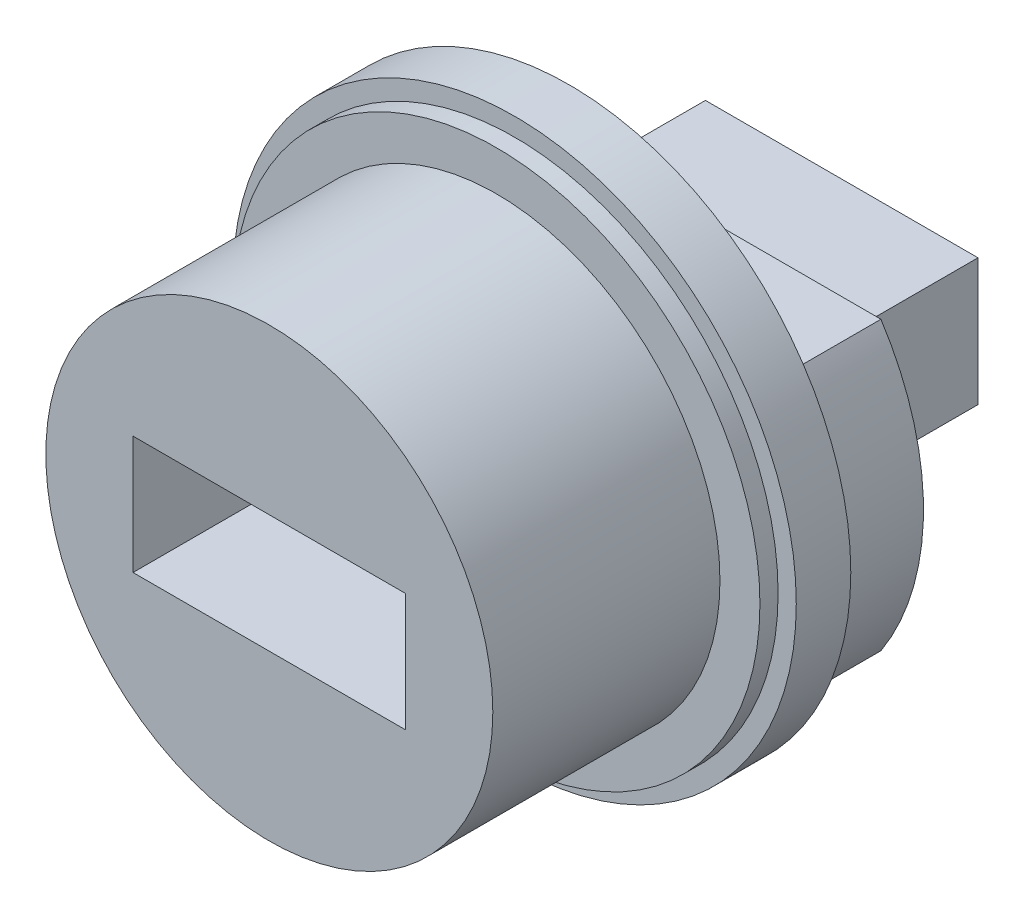
ISO-10303-21;
HEADER;
FILE_DESCRIPTION(('STEP AP214'),'2;1');
FILE_NAME('part.step','',(''),(''),'','','');
FILE_SCHEMA(('AUTOMOTIVE_DESIGN { 1 0 10303 214 1 1 1 1 }'));
ENDSEC;
DATA;
#1=APPLICATION_CONTEXT('core data for automotive mechanical design processes');
#2=APPLICATION_PROTOCOL_DEFINITION('international standard','automotive_design',2000,#1);
#3=PRODUCT_CONTEXT('',#1,'mechanical');
#4=PRODUCT('Part','Part','',(#3));
#5=PRODUCT_RELATED_PRODUCT_CATEGORY('part','',(#4));
#6=PRODUCT_DEFINITION_FORMATION('','',#4);
#7=PRODUCT_DEFINITION_CONTEXT('part definition',#1,'design');
#8=PRODUCT_DEFINITION('design','',#6,#7);
#9=PRODUCT_DEFINITION_SHAPE('','',#8);
#10=(LENGTH_UNIT() NAMED_UNIT(*) SI_UNIT(.MILLI.,.METRE.));
#11=(NAMED_UNIT(*) PLANE_ANGLE_UNIT() SI_UNIT($,.RADIAN.));
#12=(NAMED_UNIT(*) SI_UNIT($,.STERADIAN.) SOLID_ANGLE_UNIT());
#13=UNCERTAINTY_MEASURE_WITH_UNIT(LENGTH_MEASURE(1.E-05),#10,'distance_accuracy_value','');
#14=(GEOMETRIC_REPRESENTATION_CONTEXT(3) GLOBAL_UNCERTAINTY_ASSIGNED_CONTEXT((#13)) GLOBAL_UNIT_ASSIGNED_CONTEXT((#10,
#11,#12)) REPRESENTATION_CONTEXT('',''));
#15=CARTESIAN_POINT('',(0.,0.,0.));
#16=DIRECTION('',(0.,0.,1.));
#17=DIRECTION('',(1.,0.,0.));
#18=AXIS2_PLACEMENT_3D('',#15,#16,#17);
#19=CARTESIAN_POINT('',(0.,0.,-5.));
#20=DIRECTION('',(0.,0.,1.));
#21=DIRECTION('',(1.,0.,0.));
#22=AXIS2_PLACEMENT_3D('',#19,#20,#21);
#23=PLANE('',#22);
#24=CARTESIAN_POINT('',(0.,0.,-5.));
#25=DIRECTION('',(0.,0.,-1.));
#26=DIRECTION('',(1.,0.,0.));
#27=AXIS2_PLACEMENT_3D('',#24,#25,#26);
#28=CIRCLE('',#27,14.5);
#29=CARTESIAN_POINT('',(-12.1589473228565,-7.9,-5.));
#30=VERTEX_POINT('',#29);
#31=CARTESIAN_POINT('',(-12.1589473228565,7.9,-5.));
#32=VERTEX_POINT('',#31);
#33=EDGE_CURVE('E169',#30,#32,#28,.T.);
#34=ORIENTED_EDGE('',*,*,#33,.T.);
#35=DIRECTION('',(1.,0.,0.));
#36=VECTOR('',#35,1.);
#37=CARTESIAN_POINT('',(12.1589473228565,7.9,-5.));
#38=LINE('',#37,#36);
#39=CARTESIAN_POINT('',(12.1589473228565,7.9,-5.));
#40=VERTEX_POINT('',#39);
#41=EDGE_CURVE('E173',#32,#40,#38,.T.);
#42=ORIENTED_EDGE('',*,*,#41,.T.);
#43=CARTESIAN_POINT('',(0.,0.,-5.));
#44=DIRECTION('',(0.,0.,-1.));
#45=DIRECTION('',(-1.,0.,0.));
#46=AXIS2_PLACEMENT_3D('',#43,#44,#45);
#47=CIRCLE('',#46,14.5);
#48=CARTESIAN_POINT('',(12.1589473228565,-7.9,-5.));
#49=VERTEX_POINT('',#48);
#50=EDGE_CURVE('E177',#40,#49,#47,.T.);
#51=ORIENTED_EDGE('',*,*,#50,.T.);
#52=DIRECTION('',(-1.,0.,0.));
#53=VECTOR('',#52,1.);
#54=CARTESIAN_POINT('',(12.1589473228565,-7.9,-5.));
#55=LINE('',#54,#53);
#56=EDGE_CURVE('E180',#49,#30,#55,.T.);
#57=ORIENTED_EDGE('',*,*,#56,.T.);
#58=EDGE_LOOP('',(#34,#42,#51,#57));
#59=FACE_BOUND('',#58,.T.);
#60=DIRECTION('',(0.,1.,0.));
#61=VECTOR('',#60,1.);
#62=CARTESIAN_POINT('',(-7.5,-3.5,-5.));
#63=LINE('',#62,#61);
#64=CARTESIAN_POINT('',(-7.5,-3.5,-5.));
#65=VERTEX_POINT('',#64);
#66=CARTESIAN_POINT('',(-7.5,3.5,-5.));
#67=VERTEX_POINT('',#66);
#68=EDGE_CURVE('E61',#65,#67,#63,.T.);
#69=ORIENTED_EDGE('',*,*,#68,.F.);
#70=DIRECTION('',(-1.,0.,0.));
#71=VECTOR('',#70,1.);
#72=CARTESIAN_POINT('',(7.5,-3.5,-5.));
#73=LINE('',#72,#71);
#74=CARTESIAN_POINT('',(7.5,-3.5,-5.));
#75=VERTEX_POINT('',#74);
#76=EDGE_CURVE('E65',#75,#65,#73,.T.);
#77=ORIENTED_EDGE('',*,*,#76,.F.);
#78=DIRECTION('',(0.,-1.,0.));
#79=VECTOR('',#78,1.);
#80=CARTESIAN_POINT('',(7.5,-3.5,-5.));
#81=LINE('',#80,#79);
#82=CARTESIAN_POINT('',(7.5,3.5,-5.));
#83=VERTEX_POINT('',#82);
#84=EDGE_CURVE('E554',#83,#75,#81,.T.);
#85=ORIENTED_EDGE('',*,*,#84,.F.);
#86=DIRECTION('',(1.,0.,0.));
#87=VECTOR('',#86,1.);
#88=CARTESIAN_POINT('',(7.5,3.5,-5.));
#89=LINE('',#88,#87);
#90=EDGE_CURVE('E564',#67,#83,#89,.T.);
#91=ORIENTED_EDGE('',*,*,#90,.F.);
#92=EDGE_LOOP('',(#69,#77,#85,#91));
#93=FACE_BOUND('',#92,.T.);
#94=ADVANCED_FACE('F43',(#59,#93),#23,.F.);
#95=CARTESIAN_POINT('',(0.,0.,0.));
#96=DIRECTION('',(0.,0.,1.));
#97=DIRECTION('',(1.,0.,0.));
#98=AXIS2_PLACEMENT_3D('',#95,#96,#97);
#99=PLANE('',#98);
#100=CARTESIAN_POINT('',(0.,0.,0.));
#101=DIRECTION('',(0.,0.,1.));
#102=DIRECTION('',(1.,0.,0.));
#103=AXIS2_PLACEMENT_3D('',#100,#101,#102);
#104=CIRCLE('',#103,15.5);
#105=CARTESIAN_POINT('',(15.5,0.,0.));
#106=VERTEX_POINT('',#105);
#107=EDGE_CURVE('E47',#106,#106,#104,.T.);
#108=ORIENTED_EDGE('',*,*,#107,.F.);
#109=EDGE_LOOP('',(#108));
#110=FACE_BOUND('',#109,.T.);
#111=CARTESIAN_POINT('',(0.,0.,0.));
#112=DIRECTION('',(0.,0.,-1.));
#113=DIRECTION('',(1.,0.,0.));
#114=AXIS2_PLACEMENT_3D('',#111,#112,#113);
#115=CIRCLE('',#114,14.5);
#116=CARTESIAN_POINT('',(-12.1589473228565,-7.9,0.));
#117=VERTEX_POINT('',#116);
#118=CARTESIAN_POINT('',(-12.1589473228565,7.9,0.));
#119=VERTEX_POINT('',#118);
#120=EDGE_CURVE('E158',#117,#119,#115,.T.);
#121=ORIENTED_EDGE('',*,*,#120,.F.);
#122=DIRECTION('',(-1.,0.,0.));
#123=VECTOR('',#122,1.);
#124=CARTESIAN_POINT('',(12.1589473228565,-7.9,0.));
#125=LINE('',#124,#123);
#126=CARTESIAN_POINT('',(12.1589473228565,-7.9,0.));
#127=VERTEX_POINT('',#126);
#128=EDGE_CURVE('E174',#127,#117,#125,.T.);
#129=ORIENTED_EDGE('',*,*,#128,.F.);
#130=CARTESIAN_POINT('',(0.,0.,0.));
#131=DIRECTION('',(0.,0.,-1.));
#132=DIRECTION('',(-1.,0.,0.));
#133=AXIS2_PLACEMENT_3D('',#130,#131,#132);
#134=CIRCLE('',#133,14.5);
#135=CARTESIAN_POINT('',(12.1589473228565,7.9,0.));
#136=VERTEX_POINT('',#135);
#137=EDGE_CURVE('E187',#136,#127,#134,.T.);
#138=ORIENTED_EDGE('',*,*,#137,.F.);
#139=DIRECTION('',(1.,0.,0.));
#140=VECTOR('',#139,1.);
#141=CARTESIAN_POINT('',(12.1589473228565,7.9,0.));
#142=LINE('',#141,#140);
#143=EDGE_CURVE('E163',#119,#136,#142,.T.);
#144=ORIENTED_EDGE('',*,*,#143,.F.);
#145=EDGE_LOOP('',(#121,#129,#138,#144));
#146=FACE_BOUND('',#145,.T.);
#147=ADVANCED_FACE('F273',(#110,#146),#99,.F.);
#148=CARTESIAN_POINT('',(0.,0.,3.));
#149=DIRECTION('',(0.,0.,-1.));
#150=DIRECTION('',(-1.,0.,0.));
#151=AXIS2_PLACEMENT_3D('',#148,#149,#150);
#152=CYLINDRICAL_SURFACE('',#151,15.5);
#153=CARTESIAN_POINT('',(0.,0.,3.));
#154=DIRECTION('',(0.,0.,1.));
#155=DIRECTION('',(1.,0.,0.));
#156=AXIS2_PLACEMENT_3D('',#153,#154,#155);
#157=CIRCLE('',#156,15.5);
#158=CARTESIAN_POINT('',(15.5,0.,3.));
#159=VERTEX_POINT('',#158);
#160=EDGE_CURVE('E263',#159,#159,#157,.T.);
#161=ORIENTED_EDGE('',*,*,#160,.F.);
#162=EDGE_LOOP('',(#161));
#163=FACE_BOUND('',#162,.T.);
#164=ORIENTED_EDGE('',*,*,#107,.T.);
#165=EDGE_LOOP('',(#164));
#166=FACE_BOUND('',#165,.T.);
#167=ADVANCED_FACE('F45',(#163,#166),#152,.T.);
#168=CARTESIAN_POINT('',(0.,0.,3.));
#169=DIRECTION('',(0.,0.,1.));
#170=DIRECTION('',(1.,0.,0.));
#171=AXIS2_PLACEMENT_3D('',#168,#169,#170);
#172=PLANE('',#171);
#173=CARTESIAN_POINT('',(0.,0.,3.));
#174=DIRECTION('',(0.,0.,1.));
#175=DIRECTION('',(1.,0.,0.));
#176=AXIS2_PLACEMENT_3D('',#173,#174,#175);
#177=CIRCLE('',#176,14.5);
#178=CARTESIAN_POINT('',(14.5,0.,3.));
#179=VERTEX_POINT('',#178);
#180=EDGE_CURVE('E53',#179,#179,#177,.T.);
#181=ORIENTED_EDGE('',*,*,#180,.F.);
#182=EDGE_LOOP('',(#181));
#183=FACE_BOUND('',#182,.T.);
#184=ORIENTED_EDGE('',*,*,#160,.T.);
#185=EDGE_LOOP('',(#184));
#186=FACE_BOUND('',#185,.T.);
#187=ADVANCED_FACE('F480',(#183,#186),#172,.T.);
#188=CARTESIAN_POINT('',(0.,0.,4.));
#189=DIRECTION('',(0.,0.,-1.));
#190=DIRECTION('',(-1.,0.,0.));
#191=AXIS2_PLACEMENT_3D('',#188,#189,#190);
#192=CYLINDRICAL_SURFACE('',#191,14.5);
#193=CARTESIAN_POINT('',(0.,0.,4.));
#194=DIRECTION('',(0.,0.,1.));
#195=DIRECTION('',(1.,0.,0.));
#196=AXIS2_PLACEMENT_3D('',#193,#194,#195);
#197=CIRCLE('',#196,14.5);
#198=CARTESIAN_POINT('',(14.5,0.,4.));
#199=VERTEX_POINT('',#198);
#200=EDGE_CURVE('E256',#199,#199,#197,.T.);
#201=ORIENTED_EDGE('',*,*,#200,.F.);
#202=EDGE_LOOP('',(#201));
#203=FACE_BOUND('',#202,.T.);
#204=ORIENTED_EDGE('',*,*,#180,.T.);
#205=EDGE_LOOP('',(#204));
#206=FACE_BOUND('',#205,.T.);
#207=ADVANCED_FACE('F469',(#203,#206),#192,.T.);
#208=CARTESIAN_POINT('',(0.,0.,4.));
#209=DIRECTION('',(0.,0.,1.));
#210=DIRECTION('',(1.,0.,0.));
#211=AXIS2_PLACEMENT_3D('',#208,#209,#210);
#212=PLANE('',#211);
#213=CARTESIAN_POINT('',(0.,0.,4.));
#214=DIRECTION('',(0.,0.,1.));
#215=DIRECTION('',(1.,0.,0.));
#216=AXIS2_PLACEMENT_3D('',#213,#214,#215);
#217=CIRCLE('',#216,12.3);
#218=CARTESIAN_POINT('',(12.3,0.,4.));
#219=VERTEX_POINT('',#218);
#220=EDGE_CURVE('E11',#219,#219,#217,.T.);
#221=ORIENTED_EDGE('',*,*,#220,.F.);
#222=EDGE_LOOP('',(#221));
#223=FACE_BOUND('',#222,.T.);
#224=ORIENTED_EDGE('',*,*,#200,.T.);
#225=EDGE_LOOP('',(#224));
#226=FACE_BOUND('',#225,.T.);
#227=ADVANCED_FACE('F458',(#223,#226),#212,.T.);
#228=CARTESIAN_POINT('',(0.,0.,16.5));
#229=DIRECTION('',(0.,0.,-1.));
#230=DIRECTION('',(-1.,0.,0.));
#231=AXIS2_PLACEMENT_3D('',#228,#229,#230);
#232=CYLINDRICAL_SURFACE('',#231,12.3);
#233=CARTESIAN_POINT('',(0.,0.,16.5));
#234=DIRECTION('',(0.,0.,1.));
#235=DIRECTION('',(1.,0.,0.));
#236=AXIS2_PLACEMENT_3D('',#233,#234,#235);
#237=CIRCLE('',#236,12.3);
#238=CARTESIAN_POINT('',(12.3,0.,16.5));
#239=VERTEX_POINT('',#238);
#240=EDGE_CURVE('E244',#239,#239,#237,.T.);
#241=ORIENTED_EDGE('',*,*,#240,.F.);
#242=EDGE_LOOP('',(#241));
#243=FACE_BOUND('',#242,.T.);
#244=ORIENTED_EDGE('',*,*,#220,.T.);
#245=EDGE_LOOP('',(#244));
#246=FACE_BOUND('',#245,.T.);
#247=ADVANCED_FACE('F447',(#243,#246),#232,.T.);
#248=CARTESIAN_POINT('',(0.,0.,16.5));
#249=DIRECTION('',(0.,0.,1.));
#250=DIRECTION('',(1.,0.,0.));
#251=AXIS2_PLACEMENT_3D('',#248,#249,#250);
#252=PLANE('',#251);
#253=DIRECTION('',(0.,1.,0.));
#254=VECTOR('',#253,1.);
#255=CARTESIAN_POINT('',(7.5,-3.25,16.5));
#256=LINE('',#255,#254);
#257=CARTESIAN_POINT('',(7.5,-3.25,16.5));
#258=VERTEX_POINT('',#257);
#259=CARTESIAN_POINT('',(7.5,3.25,16.5));
#260=VERTEX_POINT('',#259);
#261=EDGE_CURVE('E209',#258,#260,#256,.T.);
#262=ORIENTED_EDGE('',*,*,#261,.F.);
#263=DIRECTION('',(1.,0.,0.));
#264=VECTOR('',#263,1.);
#265=CARTESIAN_POINT('',(-7.5,-3.25,16.5));
#266=LINE('',#265,#264);
#267=CARTESIAN_POINT('',(-7.5,-3.25,16.5));
#268=VERTEX_POINT('',#267);
#269=EDGE_CURVE('E215',#268,#258,#266,.T.);
#270=ORIENTED_EDGE('',*,*,#269,.F.);
#271=DIRECTION('',(0.,-1.,0.));
#272=VECTOR('',#271,1.);
#273=CARTESIAN_POINT('',(-7.5,-3.25,16.5));
#274=LINE('',#273,#272);
#275=CARTESIAN_POINT('',(-7.5,3.25,16.5));
#276=VERTEX_POINT('',#275);
#277=EDGE_CURVE('E234',#276,#268,#274,.T.);
#278=ORIENTED_EDGE('',*,*,#277,.F.);
#279=DIRECTION('',(-1.,0.,0.));
#280=VECTOR('',#279,1.);
#281=CARTESIAN_POINT('',(-7.5,3.25,16.5));
#282=LINE('',#281,#280);
#283=EDGE_CURVE('E230',#260,#276,#282,.T.);
#284=ORIENTED_EDGE('',*,*,#283,.F.);
#285=EDGE_LOOP('',(#262,#270,#278,#284));
#286=FACE_BOUND('',#285,.T.);
#287=ORIENTED_EDGE('',*,*,#240,.T.);
#288=EDGE_LOOP('',(#287));
#289=FACE_BOUND('',#288,.T.);
#290=ADVANCED_FACE('F436',(#286,#289),#252,.T.);
#291=CARTESIAN_POINT('',(7.5,-3.25,6.5));
#292=DIRECTION('',(1.,0.,0.));
#293=DIRECTION('',(0.,0.,-1.));
#294=AXIS2_PLACEMENT_3D('',#291,#292,#293);
#295=PLANE('',#294);
#296=ORIENTED_EDGE('',*,*,#261,.T.);
#297=DIRECTION('',(0.,0.,1.));
#298=VECTOR('',#297,1.);
#299=CARTESIAN_POINT('',(7.5,3.25,6.5));
#300=LINE('',#299,#298);
#301=CARTESIAN_POINT('',(7.5,3.25,6.5));
#302=VERTEX_POINT('',#301);
#303=EDGE_CURVE('E227',#302,#260,#300,.T.);
#304=ORIENTED_EDGE('',*,*,#303,.F.);
#305=DIRECTION('',(0.,1.,0.));
#306=VECTOR('',#305,1.);
#307=CARTESIAN_POINT('',(7.5,-3.25,6.5));
#308=LINE('',#307,#306);
#309=CARTESIAN_POINT('',(7.5,-3.25,6.5));
#310=VERTEX_POINT('',#309);
#311=EDGE_CURVE('E210',#310,#302,#308,.T.);
#312=ORIENTED_EDGE('',*,*,#311,.F.);
#313=DIRECTION('',(0.,0.,1.));
#314=VECTOR('',#313,1.);
#315=CARTESIAN_POINT('',(7.5,-3.25,6.5));
#316=LINE('',#315,#314);
#317=EDGE_CURVE('E241',#310,#258,#316,.T.);
#318=ORIENTED_EDGE('',*,*,#317,.T.);
#319=EDGE_LOOP('',(#296,#304,#312,#318));
#320=FACE_BOUND('',#319,.T.);
#321=ADVANCED_FACE('F425',(#320),#295,.F.);
#322=CARTESIAN_POINT('',(-7.5,-3.25,6.5));
#323=DIRECTION('',(0.,-1.,0.));
#324=DIRECTION('',(0.,0.,-1.));
#325=AXIS2_PLACEMENT_3D('',#322,#323,#324);
#326=PLANE('',#325);
#327=ORIENTED_EDGE('',*,*,#269,.T.);
#328=ORIENTED_EDGE('',*,*,#317,.F.);
#329=DIRECTION('',(1.,0.,0.));
#330=VECTOR('',#329,1.);
#331=CARTESIAN_POINT('',(-7.5,-3.25,6.5));
#332=LINE('',#331,#330);
#333=CARTESIAN_POINT('',(-7.5,-3.25,6.5));
#334=VERTEX_POINT('',#333);
#335=EDGE_CURVE('E223',#334,#310,#332,.T.);
#336=ORIENTED_EDGE('',*,*,#335,.F.);
#337=DIRECTION('',(0.,0.,1.));
#338=VECTOR('',#337,1.);
#339=CARTESIAN_POINT('',(-7.5,-3.25,6.5));
#340=LINE('',#339,#338);
#341=EDGE_CURVE('E245',#334,#268,#340,.T.);
#342=ORIENTED_EDGE('',*,*,#341,.T.);
#343=EDGE_LOOP('',(#327,#328,#336,#342));
#344=FACE_BOUND('',#343,.T.);
#345=ADVANCED_FACE('F414',(#344),#326,.F.);
#346=CARTESIAN_POINT('',(-7.5,-3.25,6.5));
#347=DIRECTION('',(-1.,0.,0.));
#348=DIRECTION('',(0.,0.,1.));
#349=AXIS2_PLACEMENT_3D('',#346,#347,#348);
#350=PLANE('',#349);
#351=ORIENTED_EDGE('',*,*,#277,.T.);
#352=ORIENTED_EDGE('',*,*,#341,.F.);
#353=DIRECTION('',(0.,-1.,0.));
#354=VECTOR('',#353,1.);
#355=CARTESIAN_POINT('',(-7.5,-3.25,6.5));
#356=LINE('',#355,#354);
#357=CARTESIAN_POINT('',(-7.5,3.25,6.5));
#358=VERTEX_POINT('',#357);
#359=EDGE_CURVE('E219',#358,#334,#356,.T.);
#360=ORIENTED_EDGE('',*,*,#359,.F.);
#361=DIRECTION('',(0.,0.,1.));
#362=VECTOR('',#361,1.);
#363=CARTESIAN_POINT('',(-7.5,3.25,6.5));
#364=LINE('',#363,#362);
#365=EDGE_CURVE('E248',#358,#276,#364,.T.);
#366=ORIENTED_EDGE('',*,*,#365,.T.);
#367=EDGE_LOOP('',(#351,#352,#360,#366));
#368=FACE_BOUND('',#367,.T.);
#369=ADVANCED_FACE('F403',(#368),#350,.F.);
#370=CARTESIAN_POINT('',(-7.5,3.25,6.5));
#371=DIRECTION('',(0.,1.,0.));
#372=DIRECTION('',(0.,0.,1.));
#373=AXIS2_PLACEMENT_3D('',#370,#371,#372);
#374=PLANE('',#373);
#375=ORIENTED_EDGE('',*,*,#283,.T.);
#376=ORIENTED_EDGE('',*,*,#365,.F.);
#377=DIRECTION('',(-1.,0.,0.));
#378=VECTOR('',#377,1.);
#379=CARTESIAN_POINT('',(-7.5,3.25,6.5));
#380=LINE('',#379,#378);
#381=EDGE_CURVE('E214',#302,#358,#380,.T.);
#382=ORIENTED_EDGE('',*,*,#381,.F.);
#383=ORIENTED_EDGE('',*,*,#303,.T.);
#384=EDGE_LOOP('',(#375,#376,#382,#383));
#385=FACE_BOUND('',#384,.T.);
#386=ADVANCED_FACE('F393',(#385),#374,.F.);
#387=CARTESIAN_POINT('',(0.,0.,6.5));
#388=DIRECTION('',(0.,0.,-1.));
#389=DIRECTION('',(-1.,0.,0.));
#390=AXIS2_PLACEMENT_3D('',#387,#388,#389);
#391=PLANE('',#390);
#392=ORIENTED_EDGE('',*,*,#311,.T.);
#393=ORIENTED_EDGE('',*,*,#381,.T.);
#394=ORIENTED_EDGE('',*,*,#359,.T.);
#395=ORIENTED_EDGE('',*,*,#335,.T.);
#396=EDGE_LOOP('',(#392,#393,#394,#395));
#397=FACE_BOUND('',#396,.T.);
#398=ADVANCED_FACE('F299',(#397),#391,.F.);
#399=CARTESIAN_POINT('',(0.,0.,-5.));
#400=DIRECTION('',(0.,0.,1.));
#401=DIRECTION('',(1.,0.,0.));
#402=AXIS2_PLACEMENT_3D('',#399,#400,#401);
#403=CYLINDRICAL_SURFACE('',#402,14.5);
#404=ORIENTED_EDGE('',*,*,#120,.T.);
#405=DIRECTION('',(0.,0.,1.));
#406=VECTOR('',#405,1.);
#407=CARTESIAN_POINT('',(-12.1589473228565,7.9,-5.));
#408=LINE('',#407,#406);
#409=EDGE_CURVE('E205',#32,#119,#408,.T.);
#410=ORIENTED_EDGE('',*,*,#409,.F.);
#411=ORIENTED_EDGE('',*,*,#33,.F.);
#412=DIRECTION('',(0.,0.,1.));
#413=VECTOR('',#412,1.);
#414=CARTESIAN_POINT('',(-12.1589473228565,-7.9,-5.));
#415=LINE('',#414,#413);
#416=EDGE_CURVE('E182',#30,#117,#415,.T.);
#417=ORIENTED_EDGE('',*,*,#416,.T.);
#418=EDGE_LOOP('',(#404,#410,#411,#417));
#419=FACE_BOUND('',#418,.T.);
#420=ADVANCED_FACE('F284',(#419),#403,.T.);
#421=CARTESIAN_POINT('',(12.1589473228565,7.9,-5.));
#422=DIRECTION('',(0.,-1.,0.));
#423=DIRECTION('',(0.,0.,-1.));
#424=AXIS2_PLACEMENT_3D('',#421,#422,#423);
#425=PLANE('',#424);
#426=ORIENTED_EDGE('',*,*,#143,.T.);
#427=DIRECTION('',(0.,0.,1.));
#428=VECTOR('',#427,1.);
#429=CARTESIAN_POINT('',(12.1589473228565,7.9,-5.));
#430=LINE('',#429,#428);
#431=EDGE_CURVE('E201',#40,#136,#430,.T.);
#432=ORIENTED_EDGE('',*,*,#431,.F.);
#433=ORIENTED_EDGE('',*,*,#41,.F.);
#434=ORIENTED_EDGE('',*,*,#409,.T.);
#435=EDGE_LOOP('',(#426,#432,#433,#434));
#436=FACE_BOUND('',#435,.T.);
#437=ADVANCED_FACE('F291',(#436),#425,.F.);
#438=CARTESIAN_POINT('',(0.,0.,-5.));
#439=DIRECTION('',(0.,0.,1.));
#440=DIRECTION('',(1.,0.,0.));
#441=AXIS2_PLACEMENT_3D('',#438,#439,#440);
#442=CYLINDRICAL_SURFACE('',#441,14.5);
#443=ORIENTED_EDGE('',*,*,#137,.T.);
#444=DIRECTION('',(0.,0.,1.));
#445=VECTOR('',#444,1.);
#446=CARTESIAN_POINT('',(12.1589473228565,-7.9,-5.));
#447=LINE('',#446,#445);
#448=EDGE_CURVE('E197',#49,#127,#447,.T.);
#449=ORIENTED_EDGE('',*,*,#448,.F.);
#450=ORIENTED_EDGE('',*,*,#50,.F.);
#451=ORIENTED_EDGE('',*,*,#431,.T.);
#452=EDGE_LOOP('',(#443,#449,#450,#451));
#453=FACE_BOUND('',#452,.T.);
#454=ADVANCED_FACE('F289',(#453),#442,.T.);
#455=CARTESIAN_POINT('',(12.1589473228565,-7.9,-5.));
#456=DIRECTION('',(0.,1.,0.));
#457=DIRECTION('',(0.,0.,1.));
#458=AXIS2_PLACEMENT_3D('',#455,#456,#457);
#459=PLANE('',#458);
#460=ORIENTED_EDGE('',*,*,#128,.T.);
#461=ORIENTED_EDGE('',*,*,#416,.F.);
#462=ORIENTED_EDGE('',*,*,#56,.F.);
#463=ORIENTED_EDGE('',*,*,#448,.T.);
#464=EDGE_LOOP('',(#460,#461,#462,#463));
#465=FACE_BOUND('',#464,.T.);
#466=ADVANCED_FACE('F280',(#465),#459,.F.);
#467=CARTESIAN_POINT('',(-7.5,-3.5,-15.));
#468=DIRECTION('',(1.,0.,0.));
#469=DIRECTION('',(0.,0.,-1.));
#470=AXIS2_PLACEMENT_3D('',#467,#468,#469);
#471=PLANE('',#470);
#472=ORIENTED_EDGE('',*,*,#68,.T.);
#473=DIRECTION('',(0.,0.,1.));
#474=VECTOR('',#473,1.);
#475=CARTESIAN_POINT('',(-7.5,3.5,-15.));
#476=LINE('',#475,#474);
#477=CARTESIAN_POINT('',(-7.5,3.5,-15.));
#478=VERTEX_POINT('',#477);
#479=EDGE_CURVE('E138',#478,#67,#476,.T.);
#480=ORIENTED_EDGE('',*,*,#479,.F.);
#481=DIRECTION('',(0.,1.,0.));
#482=VECTOR('',#481,1.);
#483=CARTESIAN_POINT('',(-7.5,-3.5,-15.));
#484=LINE('',#483,#482);
#485=CARTESIAN_POINT('',(-7.5,-3.5,-15.));
#486=VERTEX_POINT('',#485);
#487=EDGE_CURVE('E145',#486,#478,#484,.T.);
#488=ORIENTED_EDGE('',*,*,#487,.F.);
#489=DIRECTION('',(0.,0.,1.));
#490=VECTOR('',#489,1.);
#491=CARTESIAN_POINT('',(-7.5,-3.5,-15.));
#492=LINE('',#491,#490);
#493=EDGE_CURVE('E551',#486,#65,#492,.T.);
#494=ORIENTED_EDGE('',*,*,#493,.T.);
#495=EDGE_LOOP('',(#472,#480,#488,#494));
#496=FACE_BOUND('',#495,.T.);
#497=ADVANCED_FACE('F156',(#496),#471,.F.);
#498=CARTESIAN_POINT('',(7.5,3.5,-15.));
#499=DIRECTION('',(0.,-1.,0.));
#500=DIRECTION('',(0.,0.,-1.));
#501=AXIS2_PLACEMENT_3D('',#498,#499,#500);
#502=PLANE('',#501);
#503=ORIENTED_EDGE('',*,*,#90,.T.);
#504=DIRECTION('',(0.,0.,1.));
#505=VECTOR('',#504,1.);
#506=CARTESIAN_POINT('',(7.5,3.5,-15.));
#507=LINE('',#506,#505);
#508=CARTESIAN_POINT('',(7.5,3.5,-15.));
#509=VERTEX_POINT('',#508);
#510=EDGE_CURVE('E140',#509,#83,#507,.T.);
#511=ORIENTED_EDGE('',*,*,#510,.F.);
#512=DIRECTION('',(1.,0.,0.));
#513=VECTOR('',#512,1.);
#514=CARTESIAN_POINT('',(7.5,3.5,-15.));
#515=LINE('',#514,#513);
#516=EDGE_CURVE('E133',#478,#509,#515,.T.);
#517=ORIENTED_EDGE('',*,*,#516,.F.);
#518=ORIENTED_EDGE('',*,*,#479,.T.);
#519=EDGE_LOOP('',(#503,#511,#517,#518));
#520=FACE_BOUND('',#519,.T.);
#521=ADVANCED_FACE('F136',(#520),#502,.F.);
#522=CARTESIAN_POINT('',(7.5,-3.5,-15.));
#523=DIRECTION('',(-1.,0.,0.));
#524=DIRECTION('',(0.,0.,1.));
#525=AXIS2_PLACEMENT_3D('',#522,#523,#524);
#526=PLANE('',#525);
#527=ORIENTED_EDGE('',*,*,#84,.T.);
#528=DIRECTION('',(0.,0.,1.));
#529=VECTOR('',#528,1.);
#530=CARTESIAN_POINT('',(7.5,-3.5,-15.));
#531=LINE('',#530,#529);
#532=CARTESIAN_POINT('',(7.5,-3.5,-15.));
#533=VERTEX_POINT('',#532);
#534=EDGE_CURVE('E165',#533,#75,#531,.T.);
#535=ORIENTED_EDGE('',*,*,#534,.F.);
#536=DIRECTION('',(0.,-1.,0.));
#537=VECTOR('',#536,1.);
#538=CARTESIAN_POINT('',(7.5,-3.5,-15.));
#539=LINE('',#538,#537);
#540=EDGE_CURVE('E144',#509,#533,#539,.T.);
#541=ORIENTED_EDGE('',*,*,#540,.F.);
#542=ORIENTED_EDGE('',*,*,#510,.T.);
#543=EDGE_LOOP('',(#527,#535,#541,#542));
#544=FACE_BOUND('',#543,.T.);
#545=ADVANCED_FACE('F315',(#544),#526,.F.);
#546=CARTESIAN_POINT('',(7.5,-3.5,-15.));
#547=DIRECTION('',(0.,1.,0.));
#548=DIRECTION('',(0.,0.,1.));
#549=AXIS2_PLACEMENT_3D('',#546,#547,#548);
#550=PLANE('',#549);
#551=ORIENTED_EDGE('',*,*,#76,.T.);
#552=ORIENTED_EDGE('',*,*,#493,.F.);
#553=DIRECTION('',(-1.,0.,0.));
#554=VECTOR('',#553,1.);
#555=CARTESIAN_POINT('',(7.5,-3.5,-15.));
#556=LINE('',#555,#554);
#557=EDGE_CURVE('E150',#533,#486,#556,.T.);
#558=ORIENTED_EDGE('',*,*,#557,.F.);
#559=ORIENTED_EDGE('',*,*,#534,.T.);
#560=EDGE_LOOP('',(#551,#552,#558,#559));
#561=FACE_BOUND('',#560,.T.);
#562=ADVANCED_FACE('F319',(#561),#550,.F.);
#563=CARTESIAN_POINT('',(0.,0.,-15.));
#564=DIRECTION('',(0.,0.,1.));
#565=DIRECTION('',(1.,0.,0.));
#566=AXIS2_PLACEMENT_3D('',#563,#564,#565);
#567=PLANE('',#566);
#568=ORIENTED_EDGE('',*,*,#487,.T.);
#569=ORIENTED_EDGE('',*,*,#516,.T.);
#570=ORIENTED_EDGE('',*,*,#540,.T.);
#571=ORIENTED_EDGE('',*,*,#557,.T.);
#572=EDGE_LOOP('',(#568,#569,#570,#571));
#573=FACE_BOUND('',#572,.T.);
#574=ADVANCED_FACE('F148',(#573),#567,.F.);
#575=CLOSED_SHELL('',(#94,#147,#167,#187,#207,#227,#247,#290,#321,#345,#369,#386,#398,#420,#437,
#454,#466,#497,#521,#545,#562,#574));
#576=MANIFOLD_SOLID_BREP('B2',#575);
#577=ADVANCED_BREP_SHAPE_REPRESENTATION('',(#18,#576),#14);
#578=SHAPE_DEFINITION_REPRESENTATION(#9,#577);
ENDSEC;
END-ISO-10303-21;
